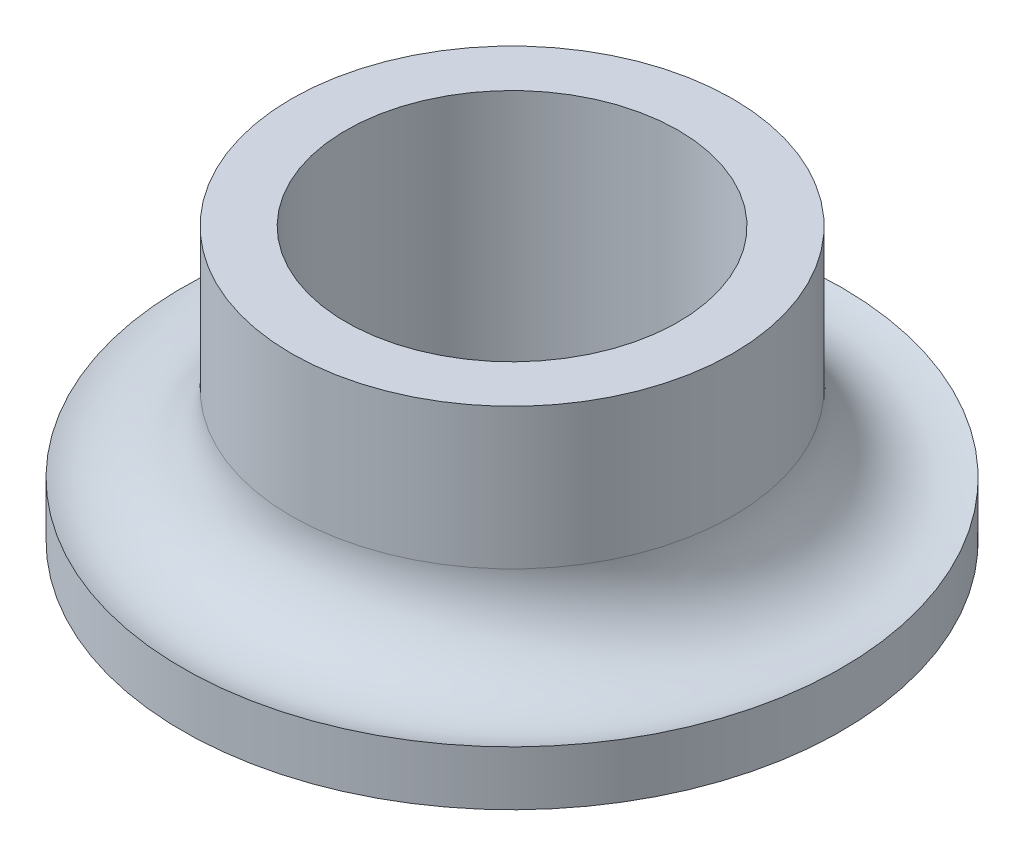
ISO-10303-21;
HEADER;
FILE_DESCRIPTION(('STEP AP214'),'2;1');
FILE_NAME('part.step','',(''),(''),'','','');
FILE_SCHEMA(('AUTOMOTIVE_DESIGN { 1 0 10303 214 1 1 1 1 }'));
ENDSEC;
DATA;
#1=APPLICATION_CONTEXT('core data for automotive mechanical design processes');
#2=APPLICATION_PROTOCOL_DEFINITION('international standard','automotive_design',2000,#1);
#3=PRODUCT_CONTEXT('',#1,'mechanical');
#4=PRODUCT('Part','Part','',(#3));
#5=PRODUCT_RELATED_PRODUCT_CATEGORY('part','',(#4));
#6=PRODUCT_DEFINITION_FORMATION('','',#4);
#7=PRODUCT_DEFINITION_CONTEXT('part definition',#1,'design');
#8=PRODUCT_DEFINITION('design','',#6,#7);
#9=PRODUCT_DEFINITION_SHAPE('','',#8);
#10=(LENGTH_UNIT() NAMED_UNIT(*) SI_UNIT(.MILLI.,.METRE.));
#11=(NAMED_UNIT(*) PLANE_ANGLE_UNIT() SI_UNIT($,.RADIAN.));
#12=(NAMED_UNIT(*) SI_UNIT($,.STERADIAN.) SOLID_ANGLE_UNIT());
#13=UNCERTAINTY_MEASURE_WITH_UNIT(LENGTH_MEASURE(1.E-05),#10,'distance_accuracy_value','');
#14=(GEOMETRIC_REPRESENTATION_CONTEXT(3) GLOBAL_UNCERTAINTY_ASSIGNED_CONTEXT((#13)) GLOBAL_UNIT_ASSIGNED_CONTEXT((#10,
#11,#12)) REPRESENTATION_CONTEXT('',''));
#15=CARTESIAN_POINT('',(0.,0.,0.));
#16=DIRECTION('',(0.,0.,1.));
#17=DIRECTION('',(1.,0.,0.));
#18=AXIS2_PLACEMENT_3D('',#15,#16,#17);
#19=CARTESIAN_POINT('',(-4.05,5.,0.));
#20=DIRECTION('',(0.,-1.,0.));
#21=DIRECTION('',(0.,0.,-1.));
#22=AXIS2_PLACEMENT_3D('',#19,#20,#21);
#23=PLANE('',#22);
#24=CARTESIAN_POINT('',(0.,5.,0.));
#25=DIRECTION('',(0.,-1.,0.));
#26=DIRECTION('',(0.,0.,-1.));
#27=AXIS2_PLACEMENT_3D('',#24,#25,#26);
#28=CIRCLE('',#27,4.05);
#29=CARTESIAN_POINT('',(0.,5.,-4.05));
#30=VERTEX_POINT('',#29);
#31=EDGE_CURVE('E53',#30,#30,#28,.T.);
#32=ORIENTED_EDGE('',*,*,#31,.F.);
#33=EDGE_LOOP('',(#32));
#34=FACE_BOUND('',#33,.T.);
#35=CARTESIAN_POINT('',(0.,5.,0.));
#36=DIRECTION('',(0.,-1.,0.));
#37=DIRECTION('',(0.,0.,-1.));
#38=AXIS2_PLACEMENT_3D('',#35,#36,#37);
#39=CIRCLE('',#38,3.05);
#40=CARTESIAN_POINT('',(0.,5.,-3.05));
#41=VERTEX_POINT('',#40);
#42=EDGE_CURVE('E10',#41,#41,#39,.T.);
#43=ORIENTED_EDGE('',*,*,#42,.T.);
#44=EDGE_LOOP('',(#43));
#45=FACE_BOUND('',#44,.T.);
#46=ADVANCED_FACE('F31',(#34,#45),#23,.F.);
#47=CARTESIAN_POINT('',(0.,0.,0.));
#48=DIRECTION('',(0.,-1.,0.));
#49=DIRECTION('',(0.,0.,-1.));
#50=AXIS2_PLACEMENT_3D('',#47,#48,#49);
#51=CYLINDRICAL_SURFACE('',#50,3.05);
#52=ORIENTED_EDGE('',*,*,#42,.F.);
#53=EDGE_LOOP('',(#52));
#54=FACE_BOUND('',#53,.T.);
#55=CARTESIAN_POINT('',(0.,0.,0.));
#56=DIRECTION('',(0.,-1.,0.));
#57=DIRECTION('',(0.,0.,-1.));
#58=AXIS2_PLACEMENT_3D('',#55,#56,#57);
#59=CIRCLE('',#58,3.05);
#60=CARTESIAN_POINT('',(0.,0.,-3.05));
#61=VERTEX_POINT('',#60);
#62=EDGE_CURVE('E37',#61,#61,#59,.T.);
#63=ORIENTED_EDGE('',*,*,#62,.T.);
#64=EDGE_LOOP('',(#63));
#65=FACE_BOUND('',#64,.T.);
#66=ADVANCED_FACE('F60',(#54,#65),#51,.F.);
#67=CARTESIAN_POINT('',(-6.05,0.,0.));
#68=DIRECTION('',(0.,1.,0.));
#69=DIRECTION('',(0.,0.,1.));
#70=AXIS2_PLACEMENT_3D('',#67,#68,#69);
#71=PLANE('',#70);
#72=ORIENTED_EDGE('',*,*,#62,.F.);
#73=EDGE_LOOP('',(#72));
#74=FACE_BOUND('',#73,.T.);
#75=CARTESIAN_POINT('',(0.,0.,0.));
#76=DIRECTION('',(0.,-1.,0.));
#77=DIRECTION('',(0.,0.,-1.));
#78=AXIS2_PLACEMENT_3D('',#75,#76,#77);
#79=CIRCLE('',#78,6.05);
#80=CARTESIAN_POINT('',(0.,0.,-6.05));
#81=VERTEX_POINT('',#80);
#82=EDGE_CURVE('E41',#81,#81,#79,.T.);
#83=ORIENTED_EDGE('',*,*,#82,.T.);
#84=EDGE_LOOP('',(#83));
#85=FACE_BOUND('',#84,.T.);
#86=ADVANCED_FACE('F64',(#74,#85),#71,.F.);
#87=CARTESIAN_POINT('',(0.,0.,0.));
#88=DIRECTION('',(0.,-1.,0.));
#89=DIRECTION('',(0.,0.,-1.));
#90=AXIS2_PLACEMENT_3D('',#87,#88,#89);
#91=CYLINDRICAL_SURFACE('',#90,6.05);
#92=ORIENTED_EDGE('',*,*,#82,.F.);
#93=EDGE_LOOP('',(#92));
#94=FACE_BOUND('',#93,.T.);
#95=CARTESIAN_POINT('',(0.,1.,0.));
#96=DIRECTION('',(0.,-1.,0.));
#97=DIRECTION('',(0.,0.,-1.));
#98=AXIS2_PLACEMENT_3D('',#95,#96,#97);
#99=CIRCLE('',#98,6.05);
#100=CARTESIAN_POINT('',(0.,1.,-6.05));
#101=VERTEX_POINT('',#100);
#102=EDGE_CURVE('E45',#101,#101,#99,.T.);
#103=ORIENTED_EDGE('',*,*,#102,.T.);
#104=EDGE_LOOP('',(#103));
#105=FACE_BOUND('',#104,.T.);
#106=ADVANCED_FACE('F69',(#94,#105),#91,.T.);
#107=CARTESIAN_POINT('',(0.,2.41421356237309,0.));
#108=DIRECTION('',(0.,-1.,0.));
#109=DIRECTION('',(0.,0.,-1.));
#110=AXIS2_PLACEMENT_3D('',#107,#108,#109);
#111=TOROIDAL_SURFACE('',#110,5.55,1.5);
#112=ORIENTED_EDGE('',*,*,#102,.F.);
#113=EDGE_LOOP('',(#112));
#114=FACE_BOUND('',#113,.T.);
#115=CARTESIAN_POINT('',(0.,2.41421356237309,0.));
#116=DIRECTION('',(0.,-1.,0.));
#117=DIRECTION('',(0.,0.,-1.));
#118=AXIS2_PLACEMENT_3D('',#115,#116,#117);
#119=CIRCLE('',#118,4.05);
#120=CARTESIAN_POINT('',(0.,2.41421356237309,-4.05));
#121=VERTEX_POINT('',#120);
#122=EDGE_CURVE('E50',#121,#121,#119,.T.);
#123=ORIENTED_EDGE('',*,*,#122,.T.);
#124=EDGE_LOOP('',(#123));
#125=FACE_BOUND('',#124,.T.);
#126=ADVANCED_FACE('F75',(#114,#125),#111,.F.);
#127=CARTESIAN_POINT('',(0.,0.,0.));
#128=DIRECTION('',(0.,-1.,0.));
#129=DIRECTION('',(0.,0.,-1.));
#130=AXIS2_PLACEMENT_3D('',#127,#128,#129);
#131=CYLINDRICAL_SURFACE('',#130,4.05);
#132=ORIENTED_EDGE('',*,*,#122,.F.);
#133=EDGE_LOOP('',(#132));
#134=FACE_BOUND('',#133,.T.);
#135=ORIENTED_EDGE('',*,*,#31,.T.);
#136=EDGE_LOOP('',(#135));
#137=FACE_BOUND('',#136,.T.);
#138=ADVANCED_FACE('F57',(#134,#137),#131,.T.);
#139=CLOSED_SHELL('',(#46,#66,#86,#106,#126,#138));
#140=MANIFOLD_SOLID_BREP('B2',#139);
#141=ADVANCED_BREP_SHAPE_REPRESENTATION('',(#18,#140),#14);
#142=SHAPE_DEFINITION_REPRESENTATION(#9,#141);
ENDSEC;
END-ISO-10303-21;
